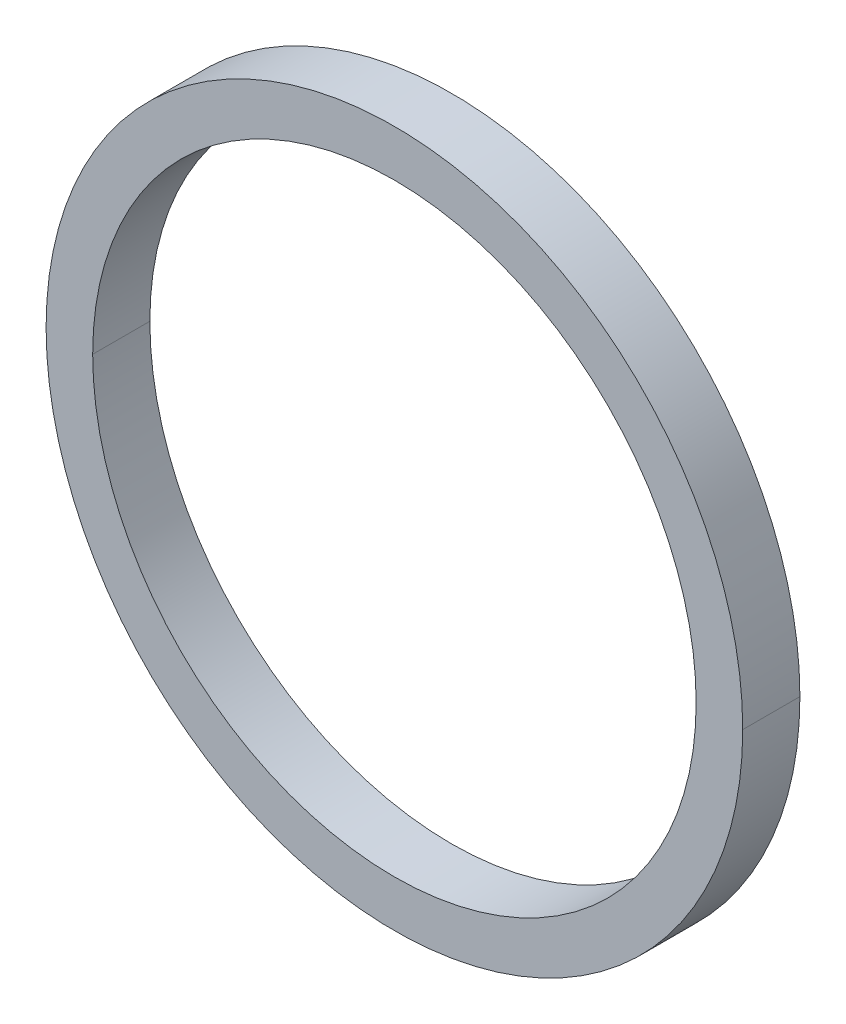
ISO-10303-21;
HEADER;
FILE_DESCRIPTION(('STEP AP214'),'2;1');
FILE_NAME('part.step','',(''),(''),'','','');
FILE_SCHEMA(('AUTOMOTIVE_DESIGN { 1 0 10303 214 1 1 1 1 }'));
ENDSEC;
DATA;
#1=APPLICATION_CONTEXT('core data for automotive mechanical design processes');
#2=APPLICATION_PROTOCOL_DEFINITION('international standard','automotive_design',2000,#1);
#3=PRODUCT_CONTEXT('',#1,'mechanical');
#4=PRODUCT('Part','Part','',(#3));
#5=PRODUCT_RELATED_PRODUCT_CATEGORY('part','',(#4));
#6=PRODUCT_DEFINITION_FORMATION('','',#4);
#7=PRODUCT_DEFINITION_CONTEXT('part definition',#1,'design');
#8=PRODUCT_DEFINITION('design','',#6,#7);
#9=PRODUCT_DEFINITION_SHAPE('','',#8);
#10=(LENGTH_UNIT() NAMED_UNIT(*) SI_UNIT(.MILLI.,.METRE.));
#11=(NAMED_UNIT(*) PLANE_ANGLE_UNIT() SI_UNIT($,.RADIAN.));
#12=(NAMED_UNIT(*) SI_UNIT($,.STERADIAN.) SOLID_ANGLE_UNIT());
#13=UNCERTAINTY_MEASURE_WITH_UNIT(LENGTH_MEASURE(1.E-05),#10,'distance_accuracy_value','');
#14=(GEOMETRIC_REPRESENTATION_CONTEXT(3) GLOBAL_UNCERTAINTY_ASSIGNED_CONTEXT((#13)) GLOBAL_UNIT_ASSIGNED_CONTEXT((#10,
#11,#12)) REPRESENTATION_CONTEXT('',''));
#15=CARTESIAN_POINT('',(0.,0.,0.));
#16=DIRECTION('',(0.,0.,1.));
#17=DIRECTION('',(1.,0.,0.));
#18=AXIS2_PLACEMENT_3D('',#15,#16,#17);
#19=CARTESIAN_POINT('',(0.,0.,2.7));
#20=DIRECTION('',(0.,0.,-1.));
#21=DIRECTION('',(-1.,0.,0.));
#22=AXIS2_PLACEMENT_3D('',#19,#20,#21);
#23=CYLINDRICAL_SURFACE('',#22,14.25);
#24=DIRECTION('',(0.,0.,-1.));
#25=VECTOR('',#24,1.);
#26=CARTESIAN_POINT('',(14.25,0.,2.7));
#27=LINE('',#26,#25);
#28=CARTESIAN_POINT('',(14.25,0.,2.7));
#29=VERTEX_POINT('',#28);
#30=CARTESIAN_POINT('',(14.25,0.,0.));
#31=VERTEX_POINT('',#30);
#32=EDGE_CURVE('E77',#29,#31,#27,.T.);
#33=ORIENTED_EDGE('',*,*,#32,.F.);
#34=CARTESIAN_POINT('',(0.,0.,2.7));
#35=DIRECTION('',(0.,0.,1.));
#36=DIRECTION('',(1.,0.,0.));
#37=AXIS2_PLACEMENT_3D('',#34,#35,#36);
#38=CIRCLE('',#37,14.25);
#39=CARTESIAN_POINT('',(-14.25,0.,2.7));
#40=VERTEX_POINT('',#39);
#41=EDGE_CURVE('E21',#29,#40,#38,.T.);
#42=ORIENTED_EDGE('',*,*,#41,.T.);
#43=DIRECTION('',(0.,0.,-1.));
#44=VECTOR('',#43,1.);
#45=CARTESIAN_POINT('',(-14.25,0.,2.7));
#46=LINE('',#45,#44);
#47=CARTESIAN_POINT('',(-14.25,0.,0.));
#48=VERTEX_POINT('',#47);
#49=EDGE_CURVE('E74',#40,#48,#46,.T.);
#50=ORIENTED_EDGE('',*,*,#49,.T.);
#51=CARTESIAN_POINT('',(0.,0.,0.));
#52=DIRECTION('',(0.,0.,1.));
#53=DIRECTION('',(1.,0.,0.));
#54=AXIS2_PLACEMENT_3D('',#51,#52,#53);
#55=CIRCLE('',#54,14.25);
#56=EDGE_CURVE('E11',#31,#48,#55,.T.);
#57=ORIENTED_EDGE('',*,*,#56,.F.);
#58=EDGE_LOOP('',(#33,#42,#50,#57));
#59=FACE_BOUND('',#58,.T.);
#60=ADVANCED_FACE('F17',(#59),#23,.F.);
#61=CARTESIAN_POINT('',(0.,0.,2.7));
#62=DIRECTION('',(0.,0.,-1.));
#63=DIRECTION('',(-1.,0.,0.));
#64=AXIS2_PLACEMENT_3D('',#61,#62,#63);
#65=CYLINDRICAL_SURFACE('',#64,16.45);
#66=DIRECTION('',(0.,0.,-1.));
#67=VECTOR('',#66,1.);
#68=CARTESIAN_POINT('',(16.45,0.,2.7));
#69=LINE('',#68,#67);
#70=CARTESIAN_POINT('',(16.45,0.,2.7));
#71=VERTEX_POINT('',#70);
#72=CARTESIAN_POINT('',(16.45,0.,0.));
#73=VERTEX_POINT('',#72);
#74=EDGE_CURVE('E102',#71,#73,#69,.T.);
#75=ORIENTED_EDGE('',*,*,#74,.F.);
#76=CARTESIAN_POINT('',(0.,0.,2.7));
#77=DIRECTION('',(0.,0.,1.));
#78=DIRECTION('',(1.,0.,0.));
#79=AXIS2_PLACEMENT_3D('',#76,#77,#78);
#80=CIRCLE('',#79,16.45);
#81=CARTESIAN_POINT('',(-16.45,0.,2.7));
#82=VERTEX_POINT('',#81);
#83=EDGE_CURVE('E84',#82,#71,#80,.T.);
#84=ORIENTED_EDGE('',*,*,#83,.F.);
#85=DIRECTION('',(0.,0.,-1.));
#86=VECTOR('',#85,1.);
#87=CARTESIAN_POINT('',(-16.45,0.,2.7));
#88=LINE('',#87,#86);
#89=CARTESIAN_POINT('',(-16.45,0.,0.));
#90=VERTEX_POINT('',#89);
#91=EDGE_CURVE('E105',#82,#90,#88,.T.);
#92=ORIENTED_EDGE('',*,*,#91,.T.);
#93=CARTESIAN_POINT('',(0.,0.,0.));
#94=DIRECTION('',(0.,0.,1.));
#95=DIRECTION('',(1.,0.,0.));
#96=AXIS2_PLACEMENT_3D('',#93,#94,#95);
#97=CIRCLE('',#96,16.45);
#98=EDGE_CURVE('E30',#90,#73,#97,.T.);
#99=ORIENTED_EDGE('',*,*,#98,.T.);
#100=EDGE_LOOP('',(#75,#84,#92,#99));
#101=FACE_BOUND('',#100,.T.);
#102=ADVANCED_FACE('F19',(#101),#65,.T.);
#103=CARTESIAN_POINT('',(0.,0.,0.));
#104=DIRECTION('',(0.,0.,1.));
#105=DIRECTION('',(1.,0.,0.));
#106=AXIS2_PLACEMENT_3D('',#103,#104,#105);
#107=PLANE('',#106);
#108=CARTESIAN_POINT('',(0.,0.,0.));
#109=DIRECTION('',(0.,0.,1.));
#110=DIRECTION('',(1.,0.,0.));
#111=AXIS2_PLACEMENT_3D('',#108,#109,#110);
#112=CIRCLE('',#111,14.25);
#113=EDGE_CURVE('E86',#48,#31,#112,.T.);
#114=ORIENTED_EDGE('',*,*,#113,.T.);
#115=ORIENTED_EDGE('',*,*,#56,.T.);
#116=EDGE_LOOP('',(#114,#115));
#117=FACE_BOUND('',#116,.T.);
#118=ORIENTED_EDGE('',*,*,#98,.F.);
#119=CARTESIAN_POINT('',(0.,0.,0.));
#120=DIRECTION('',(0.,0.,1.));
#121=DIRECTION('',(1.,0.,0.));
#122=AXIS2_PLACEMENT_3D('',#119,#120,#121);
#123=CIRCLE('',#122,16.45);
#124=EDGE_CURVE('E107',#73,#90,#123,.T.);
#125=ORIENTED_EDGE('',*,*,#124,.F.);
#126=EDGE_LOOP('',(#118,#125));
#127=FACE_BOUND('',#126,.T.);
#128=ADVANCED_FACE('F126',(#117,#127),#107,.F.);
#129=CARTESIAN_POINT('',(0.,0.,2.7));
#130=DIRECTION('',(0.,0.,1.));
#131=DIRECTION('',(1.,0.,0.));
#132=AXIS2_PLACEMENT_3D('',#129,#130,#131);
#133=PLANE('',#132);
#134=CARTESIAN_POINT('',(0.,0.,2.7));
#135=DIRECTION('',(0.,0.,1.));
#136=DIRECTION('',(1.,0.,0.));
#137=AXIS2_PLACEMENT_3D('',#134,#135,#136);
#138=CIRCLE('',#137,14.25);
#139=EDGE_CURVE('E88',#40,#29,#138,.T.);
#140=ORIENTED_EDGE('',*,*,#139,.F.);
#141=ORIENTED_EDGE('',*,*,#41,.F.);
#142=EDGE_LOOP('',(#140,#141));
#143=FACE_BOUND('',#142,.T.);
#144=ORIENTED_EDGE('',*,*,#83,.T.);
#145=CARTESIAN_POINT('',(0.,0.,2.7));
#146=DIRECTION('',(0.,0.,1.));
#147=DIRECTION('',(1.,0.,0.));
#148=AXIS2_PLACEMENT_3D('',#145,#146,#147);
#149=CIRCLE('',#148,16.45);
#150=EDGE_CURVE('E89',#71,#82,#149,.T.);
#151=ORIENTED_EDGE('',*,*,#150,.T.);
#152=EDGE_LOOP('',(#144,#151));
#153=FACE_BOUND('',#152,.T.);
#154=ADVANCED_FACE('F95',(#143,#153),#133,.T.);
#155=CARTESIAN_POINT('',(0.,0.,2.7));
#156=DIRECTION('',(0.,0.,-1.));
#157=DIRECTION('',(-1.,0.,0.));
#158=AXIS2_PLACEMENT_3D('',#155,#156,#157);
#159=CYLINDRICAL_SURFACE('',#158,16.45);
#160=ORIENTED_EDGE('',*,*,#150,.F.);
#161=ORIENTED_EDGE('',*,*,#74,.T.);
#162=ORIENTED_EDGE('',*,*,#124,.T.);
#163=ORIENTED_EDGE('',*,*,#91,.F.);
#164=EDGE_LOOP('',(#160,#161,#162,#163));
#165=FACE_BOUND('',#164,.T.);
#166=ADVANCED_FACE('F130',(#165),#159,.T.);
#167=CARTESIAN_POINT('',(0.,0.,2.7));
#168=DIRECTION('',(0.,0.,-1.));
#169=DIRECTION('',(-1.,0.,0.));
#170=AXIS2_PLACEMENT_3D('',#167,#168,#169);
#171=CYLINDRICAL_SURFACE('',#170,14.25);
#172=ORIENTED_EDGE('',*,*,#139,.T.);
#173=ORIENTED_EDGE('',*,*,#32,.T.);
#174=ORIENTED_EDGE('',*,*,#113,.F.);
#175=ORIENTED_EDGE('',*,*,#49,.F.);
#176=EDGE_LOOP('',(#172,#173,#174,#175));
#177=FACE_BOUND('',#176,.T.);
#178=ADVANCED_FACE('F83',(#177),#171,.F.);
#179=CLOSED_SHELL('',(#60,#102,#128,#154,#166,#178));
#180=MANIFOLD_SOLID_BREP('B1',#179);
#181=ADVANCED_BREP_SHAPE_REPRESENTATION('',(#18,#180),#14);
#182=SHAPE_DEFINITION_REPRESENTATION(#9,#181);
ENDSEC;
END-ISO-10303-21;
